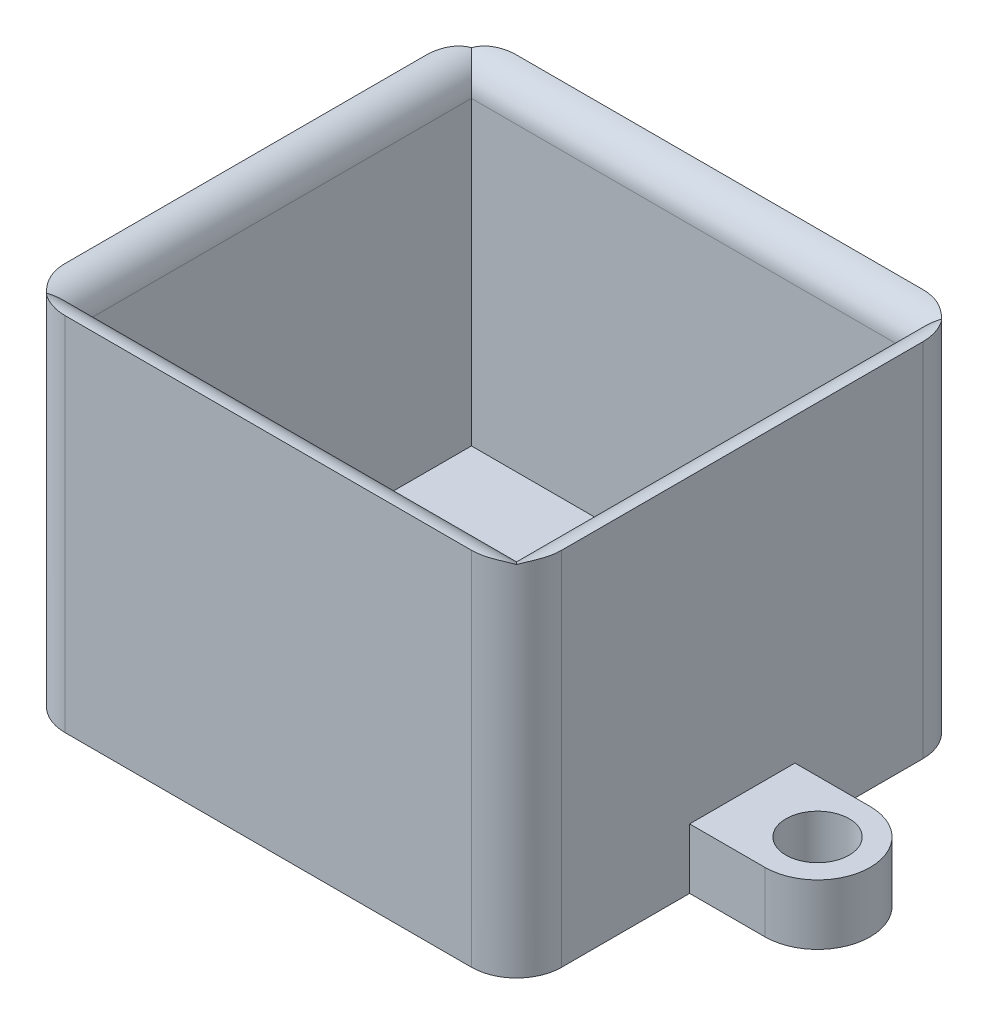
ISO-10303-21;
HEADER;
FILE_DESCRIPTION(('STEP AP214'),'2;1');
FILE_NAME('part.step','',(''),(''),'','','');
FILE_SCHEMA(('AUTOMOTIVE_DESIGN { 1 0 10303 214 1 1 1 1 }'));
ENDSEC;
DATA;
#1=APPLICATION_CONTEXT('core data for automotive mechanical design processes');
#2=APPLICATION_PROTOCOL_DEFINITION('international standard','automotive_design',2000,#1);
#3=PRODUCT_CONTEXT('',#1,'mechanical');
#4=PRODUCT('Part','Part','',(#3));
#5=PRODUCT_RELATED_PRODUCT_CATEGORY('part','',(#4));
#6=PRODUCT_DEFINITION_FORMATION('','',#4);
#7=PRODUCT_DEFINITION_CONTEXT('part definition',#1,'design');
#8=PRODUCT_DEFINITION('design','',#6,#7);
#9=PRODUCT_DEFINITION_SHAPE('','',#8);
#10=(LENGTH_UNIT() NAMED_UNIT(*) SI_UNIT(.MILLI.,.METRE.));
#11=(NAMED_UNIT(*) PLANE_ANGLE_UNIT() SI_UNIT($,.RADIAN.));
#12=(NAMED_UNIT(*) SI_UNIT($,.STERADIAN.) SOLID_ANGLE_UNIT());
#13=UNCERTAINTY_MEASURE_WITH_UNIT(LENGTH_MEASURE(1.E-05),#10,'distance_accuracy_value','');
#14=(GEOMETRIC_REPRESENTATION_CONTEXT(3) GLOBAL_UNCERTAINTY_ASSIGNED_CONTEXT((#13)) GLOBAL_UNIT_ASSIGNED_CONTEXT((#10,
#11,#12)) REPRESENTATION_CONTEXT('',''));
#15=CARTESIAN_POINT('',(0.,0.,0.));
#16=DIRECTION('',(0.,0.,1.));
#17=DIRECTION('',(1.,0.,0.));
#18=AXIS2_PLACEMENT_3D('',#15,#16,#17);
#19=CARTESIAN_POINT('',(16.5,22.,-15.));
#20=DIRECTION('',(-1.,0.,0.));
#21=DIRECTION('',(0.,0.,1.));
#22=AXIS2_PLACEMENT_3D('',#19,#20,#21);
#23=PLANE('',#22);
#24=DIRECTION('',(0.,0.,1.));
#25=VECTOR('',#24,1.);
#26=CARTESIAN_POINT('',(16.5,-2.,15.));
#27=LINE('',#26,#25);
#28=CARTESIAN_POINT('',(16.5,-2.,-12.));
#29=VERTEX_POINT('',#28);
#30=CARTESIAN_POINT('',(16.5,-2.,-3.5));
#31=VERTEX_POINT('',#30);
#32=EDGE_CURVE('E275',#29,#31,#27,.T.);
#33=ORIENTED_EDGE('',*,*,#32,.F.);
#34=DIRECTION('',(0.,-1.,0.));
#35=VECTOR('',#34,1.);
#36=CARTESIAN_POINT('',(16.5,22.,-12.));
#37=LINE('',#36,#35);
#38=CARTESIAN_POINT('',(16.5,22.,-12.));
#39=VERTEX_POINT('',#38);
#40=EDGE_CURVE('E329',#29,#39,#37,.F.);
#41=ORIENTED_EDGE('',*,*,#40,.T.);
#42=DIRECTION('',(0.,0.,-1.));
#43=VECTOR('',#42,1.);
#44=CARTESIAN_POINT('',(16.5,22.,-15.));
#45=LINE('',#44,#43);
#46=CARTESIAN_POINT('',(16.5,22.,12.));
#47=VERTEX_POINT('',#46);
#48=EDGE_CURVE('E300',#47,#39,#45,.T.);
#49=ORIENTED_EDGE('',*,*,#48,.F.);
#50=DIRECTION('',(0.,-1.,0.));
#51=VECTOR('',#50,1.);
#52=CARTESIAN_POINT('',(16.5,22.,12.));
#53=LINE('',#52,#51);
#54=CARTESIAN_POINT('',(16.5,-2.,12.));
#55=VERTEX_POINT('',#54);
#56=EDGE_CURVE('E326',#47,#55,#53,.T.);
#57=ORIENTED_EDGE('',*,*,#56,.T.);
#58=CARTESIAN_POINT('',(16.5,-2.,3.5));
#59=VERTEX_POINT('',#58);
#60=EDGE_CURVE('E274',#59,#55,#27,.T.);
#61=ORIENTED_EDGE('',*,*,#60,.F.);
#62=DIRECTION('',(0.,-1.,0.));
#63=VECTOR('',#62,1.);
#64=CARTESIAN_POINT('',(16.5,2.,3.5));
#65=LINE('',#64,#63);
#66=CARTESIAN_POINT('',(16.5,2.,3.5));
#67=VERTEX_POINT('',#66);
#68=EDGE_CURVE('E199',#67,#59,#65,.T.);
#69=ORIENTED_EDGE('',*,*,#68,.F.);
#70=DIRECTION('',(0.,0.,-1.));
#71=VECTOR('',#70,1.);
#72=CARTESIAN_POINT('',(16.5,2.,3.5));
#73=LINE('',#72,#71);
#74=CARTESIAN_POINT('',(16.5,2.,-3.5));
#75=VERTEX_POINT('',#74);
#76=EDGE_CURVE('E209',#67,#75,#73,.T.);
#77=ORIENTED_EDGE('',*,*,#76,.T.);
#78=DIRECTION('',(0.,-1.,0.));
#79=VECTOR('',#78,1.);
#80=CARTESIAN_POINT('',(16.5,2.,-3.5));
#81=LINE('',#80,#79);
#82=EDGE_CURVE('E229',#75,#31,#81,.T.);
#83=ORIENTED_EDGE('',*,*,#82,.T.);
#84=EDGE_LOOP('',(#33,#41,#49,#57,#61,#69,#77,#83));
#85=FACE_BOUND('',#84,.T.);
#86=ADVANCED_FACE('F35',(#85),#23,.F.);
#87=CARTESIAN_POINT('',(-16.5,22.,-15.));
#88=DIRECTION('',(1.,0.,0.));
#89=DIRECTION('',(0.,0.,-1.));
#90=AXIS2_PLACEMENT_3D('',#87,#88,#89);
#91=PLANE('',#90);
#92=DIRECTION('',(0.,0.,1.));
#93=VECTOR('',#92,1.);
#94=CARTESIAN_POINT('',(-16.5,22.,-15.));
#95=LINE('',#94,#93);
#96=CARTESIAN_POINT('',(-16.5,22.,-12.));
#97=VERTEX_POINT('',#96);
#98=CARTESIAN_POINT('',(-16.5,22.,12.));
#99=VERTEX_POINT('',#98);
#100=EDGE_CURVE('E306',#97,#99,#95,.T.);
#101=ORIENTED_EDGE('',*,*,#100,.F.);
#102=DIRECTION('',(0.,-1.,0.));
#103=VECTOR('',#102,1.);
#104=CARTESIAN_POINT('',(-16.5,22.,-12.));
#105=LINE('',#104,#103);
#106=CARTESIAN_POINT('',(-16.5,-2.,-12.));
#107=VERTEX_POINT('',#106);
#108=EDGE_CURVE('E335',#97,#107,#105,.T.);
#109=ORIENTED_EDGE('',*,*,#108,.T.);
#110=DIRECTION('',(0.,0.,-1.));
#111=VECTOR('',#110,1.);
#112=CARTESIAN_POINT('',(-16.5,-2.,15.));
#113=LINE('',#112,#111);
#114=CARTESIAN_POINT('',(-16.5,-2.,-3.5));
#115=VERTEX_POINT('',#114);
#116=EDGE_CURVE('E262',#115,#107,#113,.T.);
#117=ORIENTED_EDGE('',*,*,#116,.F.);
#118=DIRECTION('',(0.,-1.,0.));
#119=VECTOR('',#118,1.);
#120=CARTESIAN_POINT('',(-16.5,2.,-3.5));
#121=LINE('',#120,#119);
#122=CARTESIAN_POINT('',(-16.5,2.,-3.5));
#123=VERTEX_POINT('',#122);
#124=EDGE_CURVE('E266',#123,#115,#121,.T.);
#125=ORIENTED_EDGE('',*,*,#124,.F.);
#126=DIRECTION('',(0.,0.,1.));
#127=VECTOR('',#126,1.);
#128=CARTESIAN_POINT('',(-16.5,2.,3.5));
#129=LINE('',#128,#127);
#130=CARTESIAN_POINT('',(-16.5,2.,3.5));
#131=VERTEX_POINT('',#130);
#132=EDGE_CURVE('E246',#123,#131,#129,.T.);
#133=ORIENTED_EDGE('',*,*,#132,.T.);
#134=DIRECTION('',(0.,-1.,0.));
#135=VECTOR('',#134,1.);
#136=CARTESIAN_POINT('',(-16.5,2.,3.5));
#137=LINE('',#136,#135);
#138=CARTESIAN_POINT('',(-16.5,-2.,3.5));
#139=VERTEX_POINT('',#138);
#140=EDGE_CURVE('E263',#131,#139,#137,.T.);
#141=ORIENTED_EDGE('',*,*,#140,.T.);
#142=CARTESIAN_POINT('',(-16.5,-2.,12.));
#143=VERTEX_POINT('',#142);
#144=EDGE_CURVE('E269',#143,#139,#113,.T.);
#145=ORIENTED_EDGE('',*,*,#144,.F.);
#146=DIRECTION('',(0.,-1.,0.));
#147=VECTOR('',#146,1.);
#148=CARTESIAN_POINT('',(-16.5,22.,12.));
#149=LINE('',#148,#147);
#150=EDGE_CURVE('E332',#143,#99,#149,.F.);
#151=ORIENTED_EDGE('',*,*,#150,.T.);
#152=EDGE_LOOP('',(#101,#109,#117,#125,#133,#141,#145,#151));
#153=FACE_BOUND('',#152,.T.);
#154=ADVANCED_FACE('F503',(#153),#91,.F.);
#155=CARTESIAN_POINT('',(-16.5,22.,-15.));
#156=DIRECTION('',(0.,0.,1.));
#157=DIRECTION('',(1.,0.,0.));
#158=AXIS2_PLACEMENT_3D('',#155,#156,#157);
#159=PLANE('',#158);
#160=DIRECTION('',(-1.,0.,0.));
#161=VECTOR('',#160,1.);
#162=CARTESIAN_POINT('',(-16.5,22.,-15.));
#163=LINE('',#162,#161);
#164=CARTESIAN_POINT('',(13.5,22.,-15.));
#165=VERTEX_POINT('',#164);
#166=CARTESIAN_POINT('',(-13.5,22.,-15.));
#167=VERTEX_POINT('',#166);
#168=EDGE_CURVE('E303',#165,#167,#163,.T.);
#169=ORIENTED_EDGE('',*,*,#168,.F.);
#170=DIRECTION('',(0.,-1.,0.));
#171=VECTOR('',#170,1.);
#172=CARTESIAN_POINT('',(13.5,22.,-15.));
#173=LINE('',#172,#171);
#174=CARTESIAN_POINT('',(13.5,-2.,-15.));
#175=VERTEX_POINT('',#174);
#176=EDGE_CURVE('E315',#165,#175,#173,.T.);
#177=ORIENTED_EDGE('',*,*,#176,.T.);
#178=DIRECTION('',(1.,0.,0.));
#179=VECTOR('',#178,1.);
#180=CARTESIAN_POINT('',(-16.5,-2.,-15.));
#181=LINE('',#180,#179);
#182=CARTESIAN_POINT('',(-13.5,-2.,-15.));
#183=VERTEX_POINT('',#182);
#184=EDGE_CURVE('E271',#183,#175,#181,.T.);
#185=ORIENTED_EDGE('',*,*,#184,.F.);
#186=DIRECTION('',(0.,-1.,0.));
#187=VECTOR('',#186,1.);
#188=CARTESIAN_POINT('',(-13.5,22.,-15.));
#189=LINE('',#188,#187);
#190=EDGE_CURVE('E312',#183,#167,#189,.F.);
#191=ORIENTED_EDGE('',*,*,#190,.T.);
#192=EDGE_LOOP('',(#169,#177,#185,#191));
#193=FACE_BOUND('',#192,.T.);
#194=ADVANCED_FACE('F433',(#193),#159,.F.);
#195=CARTESIAN_POINT('',(-16.5,22.,15.));
#196=DIRECTION('',(0.,0.,-1.));
#197=DIRECTION('',(-1.,0.,0.));
#198=AXIS2_PLACEMENT_3D('',#195,#196,#197);
#199=PLANE('',#198);
#200=DIRECTION('',(-1.,0.,0.));
#201=VECTOR('',#200,1.);
#202=CARTESIAN_POINT('',(-16.5,-2.,15.));
#203=LINE('',#202,#201);
#204=CARTESIAN_POINT('',(13.5,-2.,15.));
#205=VERTEX_POINT('',#204);
#206=CARTESIAN_POINT('',(-13.5,-2.,15.));
#207=VERTEX_POINT('',#206);
#208=EDGE_CURVE('E277',#205,#207,#203,.T.);
#209=ORIENTED_EDGE('',*,*,#208,.F.);
#210=DIRECTION('',(0.,-1.,0.));
#211=VECTOR('',#210,1.);
#212=CARTESIAN_POINT('',(13.5,22.,15.));
#213=LINE('',#212,#211);
#214=CARTESIAN_POINT('',(13.5,22.,15.));
#215=VERTEX_POINT('',#214);
#216=EDGE_CURVE('E341',#205,#215,#213,.F.);
#217=ORIENTED_EDGE('',*,*,#216,.T.);
#218=DIRECTION('',(1.,0.,0.));
#219=VECTOR('',#218,1.);
#220=CARTESIAN_POINT('',(-16.5,22.,15.));
#221=LINE('',#220,#219);
#222=CARTESIAN_POINT('',(-13.5,22.,15.));
#223=VERTEX_POINT('',#222);
#224=EDGE_CURVE('E309',#223,#215,#221,.T.);
#225=ORIENTED_EDGE('',*,*,#224,.F.);
#226=DIRECTION('',(0.,-1.,0.));
#227=VECTOR('',#226,1.);
#228=CARTESIAN_POINT('',(-13.5,22.,15.));
#229=LINE('',#228,#227);
#230=EDGE_CURVE('E338',#223,#207,#229,.T.);
#231=ORIENTED_EDGE('',*,*,#230,.T.);
#232=EDGE_LOOP('',(#209,#217,#225,#231));
#233=FACE_BOUND('',#232,.T.);
#234=ADVANCED_FACE('F453',(#233),#199,.F.);
#235=CARTESIAN_POINT('',(14.5,22.,-13.));
#236=DIRECTION('',(-1.,0.,0.));
#237=DIRECTION('',(0.,0.,1.));
#238=AXIS2_PLACEMENT_3D('',#235,#236,#237);
#239=PLANE('',#238);
#240=DIRECTION('',(0.,-1.,0.));
#241=VECTOR('',#240,1.);
#242=CARTESIAN_POINT('',(14.5,22.,13.));
#243=LINE('',#242,#241);
#244=CARTESIAN_POINT('',(14.5,20.,13.));
#245=VERTEX_POINT('',#244);
#246=CARTESIAN_POINT('',(14.5,0.,13.));
#247=VERTEX_POINT('',#246);
#248=EDGE_CURVE('E292',#245,#247,#243,.T.);
#249=ORIENTED_EDGE('',*,*,#248,.F.);
#250=DIRECTION('',(0.,0.,-1.));
#251=VECTOR('',#250,1.);
#252=CARTESIAN_POINT('',(14.5,20.,-13.));
#253=LINE('',#252,#251);
#254=CARTESIAN_POINT('',(14.5,20.,-13.));
#255=VERTEX_POINT('',#254);
#256=EDGE_CURVE('E344',#245,#255,#253,.T.);
#257=ORIENTED_EDGE('',*,*,#256,.T.);
#258=DIRECTION('',(0.,-1.,0.));
#259=VECTOR('',#258,1.);
#260=CARTESIAN_POINT('',(14.5,22.,-13.));
#261=LINE('',#260,#259);
#262=CARTESIAN_POINT('',(14.5,0.,-13.));
#263=VERTEX_POINT('',#262);
#264=EDGE_CURVE('E298',#255,#263,#261,.T.);
#265=ORIENTED_EDGE('',*,*,#264,.T.);
#266=DIRECTION('',(0.,0.,-1.));
#267=VECTOR('',#266,1.);
#268=CARTESIAN_POINT('',(14.5,0.,-13.));
#269=LINE('',#268,#267);
#270=EDGE_CURVE('E280',#247,#263,#269,.T.);
#271=ORIENTED_EDGE('',*,*,#270,.F.);
#272=EDGE_LOOP('',(#249,#257,#265,#271));
#273=FACE_BOUND('',#272,.T.);
#274=ADVANCED_FACE('F477',(#273),#239,.T.);
#275=CARTESIAN_POINT('',(-14.5,22.,-13.));
#276=DIRECTION('',(0.,0.,1.));
#277=DIRECTION('',(1.,0.,0.));
#278=AXIS2_PLACEMENT_3D('',#275,#276,#277);
#279=PLANE('',#278);
#280=ORIENTED_EDGE('',*,*,#264,.F.);
#281=DIRECTION('',(-1.,0.,0.));
#282=VECTOR('',#281,1.);
#283=CARTESIAN_POINT('',(-14.5,20.,-13.));
#284=LINE('',#283,#282);
#285=CARTESIAN_POINT('',(-14.5,20.,-13.));
#286=VERTEX_POINT('',#285);
#287=EDGE_CURVE('E415',#255,#286,#284,.T.);
#288=ORIENTED_EDGE('',*,*,#287,.T.);
#289=DIRECTION('',(0.,-1.,0.));
#290=VECTOR('',#289,1.);
#291=CARTESIAN_POINT('',(-14.5,22.,-13.));
#292=LINE('',#291,#290);
#293=CARTESIAN_POINT('',(-14.5,0.,-13.));
#294=VERTEX_POINT('',#293);
#295=EDGE_CURVE('E296',#286,#294,#292,.T.);
#296=ORIENTED_EDGE('',*,*,#295,.T.);
#297=DIRECTION('',(-1.,0.,0.));
#298=VECTOR('',#297,1.);
#299=CARTESIAN_POINT('',(-14.5,0.,-13.));
#300=LINE('',#299,#298);
#301=EDGE_CURVE('E283',#263,#294,#300,.T.);
#302=ORIENTED_EDGE('',*,*,#301,.F.);
#303=EDGE_LOOP('',(#280,#288,#296,#302));
#304=FACE_BOUND('',#303,.T.);
#305=ADVANCED_FACE('F480',(#304),#279,.T.);
#306=CARTESIAN_POINT('',(-14.5,22.,-13.));
#307=DIRECTION('',(1.,0.,0.));
#308=DIRECTION('',(0.,0.,-1.));
#309=AXIS2_PLACEMENT_3D('',#306,#307,#308);
#310=PLANE('',#309);
#311=ORIENTED_EDGE('',*,*,#295,.F.);
#312=DIRECTION('',(0.,0.,1.));
#313=VECTOR('',#312,1.);
#314=CARTESIAN_POINT('',(-14.5,20.,-13.));
#315=LINE('',#314,#313);
#316=CARTESIAN_POINT('',(-14.5,20.,13.));
#317=VERTEX_POINT('',#316);
#318=EDGE_CURVE('E61',#286,#317,#315,.T.);
#319=ORIENTED_EDGE('',*,*,#318,.T.);
#320=DIRECTION('',(0.,-1.,0.));
#321=VECTOR('',#320,1.);
#322=CARTESIAN_POINT('',(-14.5,22.,13.));
#323=LINE('',#322,#321);
#324=CARTESIAN_POINT('',(-14.5,0.,13.));
#325=VERTEX_POINT('',#324);
#326=EDGE_CURVE('E294',#317,#325,#323,.T.);
#327=ORIENTED_EDGE('',*,*,#326,.T.);
#328=DIRECTION('',(0.,0.,1.));
#329=VECTOR('',#328,1.);
#330=CARTESIAN_POINT('',(-14.5,0.,-13.));
#331=LINE('',#330,#329);
#332=EDGE_CURVE('E286',#294,#325,#331,.T.);
#333=ORIENTED_EDGE('',*,*,#332,.F.);
#334=EDGE_LOOP('',(#311,#319,#327,#333));
#335=FACE_BOUND('',#334,.T.);
#336=ADVANCED_FACE('F518',(#335),#310,.T.);
#337=CARTESIAN_POINT('',(-14.5,22.,13.));
#338=DIRECTION('',(0.,0.,-1.));
#339=DIRECTION('',(-1.,0.,0.));
#340=AXIS2_PLACEMENT_3D('',#337,#338,#339);
#341=PLANE('',#340);
#342=ORIENTED_EDGE('',*,*,#326,.F.);
#343=DIRECTION('',(1.,0.,0.));
#344=VECTOR('',#343,1.);
#345=CARTESIAN_POINT('',(-14.5,20.,13.));
#346=LINE('',#345,#344);
#347=EDGE_CURVE('E11',#317,#245,#346,.T.);
#348=ORIENTED_EDGE('',*,*,#347,.T.);
#349=ORIENTED_EDGE('',*,*,#248,.T.);
#350=DIRECTION('',(1.,0.,0.));
#351=VECTOR('',#350,1.);
#352=CARTESIAN_POINT('',(-14.5,0.,13.));
#353=LINE('',#352,#351);
#354=EDGE_CURVE('E289',#325,#247,#353,.T.);
#355=ORIENTED_EDGE('',*,*,#354,.F.);
#356=EDGE_LOOP('',(#342,#348,#349,#355));
#357=FACE_BOUND('',#356,.T.);
#358=ADVANCED_FACE('F486',(#357),#341,.T.);
#359=CARTESIAN_POINT('',(0.,0.,0.));
#360=DIRECTION('',(0.,-1.,0.));
#361=DIRECTION('',(0.,0.,-1.));
#362=AXIS2_PLACEMENT_3D('',#359,#360,#361);
#363=PLANE('',#362);
#364=ORIENTED_EDGE('',*,*,#354,.T.);
#365=ORIENTED_EDGE('',*,*,#270,.T.);
#366=ORIENTED_EDGE('',*,*,#301,.T.);
#367=ORIENTED_EDGE('',*,*,#332,.T.);
#368=EDGE_LOOP('',(#364,#365,#366,#367));
#369=FACE_BOUND('',#368,.T.);
#370=ADVANCED_FACE('F483',(#369),#363,.F.);
#371=CARTESIAN_POINT('',(0.,-2.,0.));
#372=DIRECTION('',(0.,-1.,0.));
#373=DIRECTION('',(0.,0.,-1.));
#374=AXIS2_PLACEMENT_3D('',#371,#372,#373);
#375=PLANE('',#374);
#376=ORIENTED_EDGE('',*,*,#184,.T.);
#377=CARTESIAN_POINT('',(13.5,-2.,-12.));
#378=DIRECTION('',(0.,-1.,0.));
#379=DIRECTION('',(0.,0.,-1.));
#380=AXIS2_PLACEMENT_3D('',#377,#378,#379);
#381=CIRCLE('',#380,3.);
#382=EDGE_CURVE('E324',#175,#29,#381,.T.);
#383=ORIENTED_EDGE('',*,*,#382,.T.);
#384=ORIENTED_EDGE('',*,*,#32,.T.);
#385=DIRECTION('',(1.,0.,0.));
#386=VECTOR('',#385,1.);
#387=CARTESIAN_POINT('',(21.5,-2.,-3.5));
#388=LINE('',#387,#386);
#389=CARTESIAN_POINT('',(21.5,-2.,-3.5));
#390=VERTEX_POINT('',#389);
#391=EDGE_CURVE('E213',#31,#390,#388,.T.);
#392=ORIENTED_EDGE('',*,*,#391,.T.);
#393=CARTESIAN_POINT('',(21.5,-2.,0.));
#394=DIRECTION('',(0.,-1.,0.));
#395=DIRECTION('',(0.,0.,1.));
#396=AXIS2_PLACEMENT_3D('',#393,#394,#395);
#397=CIRCLE('',#396,3.5);
#398=CARTESIAN_POINT('',(21.5,-2.,3.5));
#399=VERTEX_POINT('',#398);
#400=EDGE_CURVE('E223',#390,#399,#397,.T.);
#401=ORIENTED_EDGE('',*,*,#400,.T.);
#402=DIRECTION('',(-1.,0.,0.));
#403=VECTOR('',#402,1.);
#404=CARTESIAN_POINT('',(21.5,-2.,3.5));
#405=LINE('',#404,#403);
#406=EDGE_CURVE('E194',#399,#59,#405,.T.);
#407=ORIENTED_EDGE('',*,*,#406,.T.);
#408=ORIENTED_EDGE('',*,*,#60,.T.);
#409=CARTESIAN_POINT('',(13.5,-2.,12.));
#410=DIRECTION('',(0.,-1.,0.));
#411=DIRECTION('',(0.,0.,-1.));
#412=AXIS2_PLACEMENT_3D('',#409,#410,#411);
#413=CIRCLE('',#412,3.);
#414=EDGE_CURVE('E320',#55,#205,#413,.T.);
#415=ORIENTED_EDGE('',*,*,#414,.T.);
#416=ORIENTED_EDGE('',*,*,#208,.T.);
#417=CARTESIAN_POINT('',(-13.5,-2.,12.));
#418=DIRECTION('',(0.,-1.,0.));
#419=DIRECTION('',(0.,0.,-1.));
#420=AXIS2_PLACEMENT_3D('',#417,#418,#419);
#421=CIRCLE('',#420,3.);
#422=EDGE_CURVE('E318',#207,#143,#421,.T.);
#423=ORIENTED_EDGE('',*,*,#422,.T.);
#424=ORIENTED_EDGE('',*,*,#144,.T.);
#425=DIRECTION('',(-1.,0.,0.));
#426=VECTOR('',#425,1.);
#427=CARTESIAN_POINT('',(-21.5,-2.,3.5));
#428=LINE('',#427,#426);
#429=CARTESIAN_POINT('',(-21.5,-2.,3.5));
#430=VERTEX_POINT('',#429);
#431=EDGE_CURVE('E243',#139,#430,#428,.T.);
#432=ORIENTED_EDGE('',*,*,#431,.T.);
#433=CARTESIAN_POINT('',(-21.5,-2.,0.));
#434=DIRECTION('',(0.,-1.,0.));
#435=DIRECTION('',(0.,0.,-1.));
#436=AXIS2_PLACEMENT_3D('',#433,#434,#435);
#437=CIRCLE('',#436,3.5);
#438=CARTESIAN_POINT('',(-21.5,-2.,-3.5));
#439=VERTEX_POINT('',#438);
#440=EDGE_CURVE('E236',#430,#439,#437,.T.);
#441=ORIENTED_EDGE('',*,*,#440,.T.);
#442=DIRECTION('',(1.,0.,0.));
#443=VECTOR('',#442,1.);
#444=CARTESIAN_POINT('',(-21.5,-2.,-3.5));
#445=LINE('',#444,#443);
#446=EDGE_CURVE('E255',#439,#115,#445,.T.);
#447=ORIENTED_EDGE('',*,*,#446,.T.);
#448=ORIENTED_EDGE('',*,*,#116,.T.);
#449=CARTESIAN_POINT('',(-13.5,-2.,-12.));
#450=DIRECTION('',(0.,-1.,0.));
#451=DIRECTION('',(0.,0.,-1.));
#452=AXIS2_PLACEMENT_3D('',#449,#450,#451);
#453=CIRCLE('',#452,3.);
#454=EDGE_CURVE('E322',#107,#183,#453,.T.);
#455=ORIENTED_EDGE('',*,*,#454,.T.);
#456=EDGE_LOOP('',(#376,#383,#384,#392,#401,#407,#408,#415,#416,#423,#424,#432,#441,#447,#448,#455));
#457=FACE_BOUND('',#456,.T.);
#458=CARTESIAN_POINT('',(-21.5,-2.,0.));
#459=DIRECTION('',(0.,-1.,0.));
#460=DIRECTION('',(0.,0.,-1.));
#461=AXIS2_PLACEMENT_3D('',#458,#459,#460);
#462=CIRCLE('',#461,2.1);
#463=CARTESIAN_POINT('',(-21.5,-2.,-2.1));
#464=VERTEX_POINT('',#463);
#465=EDGE_CURVE('E228',#464,#464,#462,.T.);
#466=ORIENTED_EDGE('',*,*,#465,.F.);
#467=EDGE_LOOP('',(#466));
#468=FACE_BOUND('',#467,.T.);
#469=CARTESIAN_POINT('',(21.5,-2.,0.));
#470=DIRECTION('',(0.,-1.,0.));
#471=DIRECTION('',(0.,0.,1.));
#472=AXIS2_PLACEMENT_3D('',#469,#470,#471);
#473=CIRCLE('',#472,2.1);
#474=CARTESIAN_POINT('',(21.5,-2.,2.1));
#475=VERTEX_POINT('',#474);
#476=EDGE_CURVE('E218',#475,#475,#473,.T.);
#477=ORIENTED_EDGE('',*,*,#476,.F.);
#478=EDGE_LOOP('',(#477));
#479=FACE_BOUND('',#478,.T.);
#480=ADVANCED_FACE('F439',(#457,#468,#479),#375,.T.);
#481=CARTESIAN_POINT('',(-21.5,2.,0.));
#482=DIRECTION('',(0.,-1.,0.));
#483=DIRECTION('',(0.,0.,-1.));
#484=AXIS2_PLACEMENT_3D('',#481,#482,#483);
#485=CYLINDRICAL_SURFACE('',#484,3.5);
#486=ORIENTED_EDGE('',*,*,#440,.F.);
#487=DIRECTION('',(0.,-1.,0.));
#488=VECTOR('',#487,1.);
#489=CARTESIAN_POINT('',(-21.5,2.,3.5));
#490=LINE('',#489,#488);
#491=CARTESIAN_POINT('',(-21.5,2.,3.5));
#492=VERTEX_POINT('',#491);
#493=EDGE_CURVE('E260',#492,#430,#490,.T.);
#494=ORIENTED_EDGE('',*,*,#493,.F.);
#495=CARTESIAN_POINT('',(-21.5,2.,0.));
#496=DIRECTION('',(0.,-1.,0.));
#497=DIRECTION('',(0.,0.,-1.));
#498=AXIS2_PLACEMENT_3D('',#495,#496,#497);
#499=CIRCLE('',#498,3.5);
#500=CARTESIAN_POINT('',(-21.5,2.,-3.5));
#501=VERTEX_POINT('',#500);
#502=EDGE_CURVE('E239',#492,#501,#499,.T.);
#503=ORIENTED_EDGE('',*,*,#502,.T.);
#504=DIRECTION('',(0.,-1.,0.));
#505=VECTOR('',#504,1.);
#506=CARTESIAN_POINT('',(-21.5,2.,-3.5));
#507=LINE('',#506,#505);
#508=EDGE_CURVE('E252',#501,#439,#507,.T.);
#509=ORIENTED_EDGE('',*,*,#508,.T.);
#510=EDGE_LOOP('',(#486,#494,#503,#509));
#511=FACE_BOUND('',#510,.T.);
#512=ADVANCED_FACE('F527',(#511),#485,.T.);
#513=CARTESIAN_POINT('',(-21.5,2.,3.5));
#514=DIRECTION('',(0.,0.,1.));
#515=DIRECTION('',(1.,0.,0.));
#516=AXIS2_PLACEMENT_3D('',#513,#514,#515);
#517=PLANE('',#516);
#518=ORIENTED_EDGE('',*,*,#431,.F.);
#519=ORIENTED_EDGE('',*,*,#140,.F.);
#520=DIRECTION('',(-1.,0.,0.));
#521=VECTOR('',#520,1.);
#522=CARTESIAN_POINT('',(-21.5,2.,3.5));
#523=LINE('',#522,#521);
#524=EDGE_CURVE('E249',#131,#492,#523,.T.);
#525=ORIENTED_EDGE('',*,*,#524,.T.);
#526=ORIENTED_EDGE('',*,*,#493,.T.);
#527=EDGE_LOOP('',(#518,#519,#525,#526));
#528=FACE_BOUND('',#527,.T.);
#529=ADVANCED_FACE('F530',(#528),#517,.T.);
#530=CARTESIAN_POINT('',(-21.5,2.,-3.5));
#531=DIRECTION('',(0.,0.,-1.));
#532=DIRECTION('',(-1.,0.,0.));
#533=AXIS2_PLACEMENT_3D('',#530,#531,#532);
#534=PLANE('',#533);
#535=ORIENTED_EDGE('',*,*,#446,.F.);
#536=ORIENTED_EDGE('',*,*,#508,.F.);
#537=DIRECTION('',(1.,0.,0.));
#538=VECTOR('',#537,1.);
#539=CARTESIAN_POINT('',(-21.5,2.,-3.5));
#540=LINE('',#539,#538);
#541=EDGE_CURVE('E242',#501,#123,#540,.T.);
#542=ORIENTED_EDGE('',*,*,#541,.T.);
#543=ORIENTED_EDGE('',*,*,#124,.T.);
#544=EDGE_LOOP('',(#535,#536,#542,#543));
#545=FACE_BOUND('',#544,.T.);
#546=ADVANCED_FACE('F532',(#545),#534,.T.);
#547=CARTESIAN_POINT('',(-21.5,2.,0.));
#548=DIRECTION('',(0.,-1.,0.));
#549=DIRECTION('',(0.,0.,-1.));
#550=AXIS2_PLACEMENT_3D('',#547,#548,#549);
#551=PLANE('',#550);
#552=CARTESIAN_POINT('',(-21.5,2.,0.));
#553=DIRECTION('',(0.,-1.,0.));
#554=DIRECTION('',(0.,0.,-1.));
#555=AXIS2_PLACEMENT_3D('',#552,#553,#554);
#556=CIRCLE('',#555,2.1);
#557=CARTESIAN_POINT('',(-21.5,2.,-2.1));
#558=VERTEX_POINT('',#557);
#559=EDGE_CURVE('E233',#558,#558,#556,.T.);
#560=ORIENTED_EDGE('',*,*,#559,.T.);
#561=EDGE_LOOP('',(#560));
#562=FACE_BOUND('',#561,.T.);
#563=ORIENTED_EDGE('',*,*,#502,.F.);
#564=ORIENTED_EDGE('',*,*,#524,.F.);
#565=ORIENTED_EDGE('',*,*,#132,.F.);
#566=ORIENTED_EDGE('',*,*,#541,.F.);
#567=EDGE_LOOP('',(#563,#564,#565,#566));
#568=FACE_BOUND('',#567,.T.);
#569=ADVANCED_FACE('F535',(#562,#568),#551,.F.);
#570=CARTESIAN_POINT('',(-21.5,2.,0.));
#571=DIRECTION('',(0.,-1.,0.));
#572=DIRECTION('',(0.,0.,-1.));
#573=AXIS2_PLACEMENT_3D('',#570,#571,#572);
#574=CYLINDRICAL_SURFACE('',#573,2.1);
#575=ORIENTED_EDGE('',*,*,#559,.F.);
#576=EDGE_LOOP('',(#575));
#577=FACE_BOUND('',#576,.T.);
#578=ORIENTED_EDGE('',*,*,#465,.T.);
#579=EDGE_LOOP('',(#578));
#580=FACE_BOUND('',#579,.T.);
#581=ADVANCED_FACE('F542',(#577,#580),#574,.F.);
#582=CARTESIAN_POINT('',(21.5,2.,0.));
#583=DIRECTION('',(0.,-1.,0.));
#584=DIRECTION('',(0.,0.,-1.));
#585=AXIS2_PLACEMENT_3D('',#582,#583,#584);
#586=CYLINDRICAL_SURFACE('',#585,3.5);
#587=ORIENTED_EDGE('',*,*,#400,.F.);
#588=DIRECTION('',(0.,-1.,0.));
#589=VECTOR('',#588,1.);
#590=CARTESIAN_POINT('',(21.5,2.,-3.5));
#591=LINE('',#590,#589);
#592=CARTESIAN_POINT('',(21.5,2.,-3.5));
#593=VERTEX_POINT('',#592);
#594=EDGE_CURVE('E212',#593,#390,#591,.T.);
#595=ORIENTED_EDGE('',*,*,#594,.F.);
#596=CARTESIAN_POINT('',(21.5,2.,0.));
#597=DIRECTION('',(0.,-1.,0.));
#598=DIRECTION('',(0.,0.,1.));
#599=AXIS2_PLACEMENT_3D('',#596,#597,#598);
#600=CIRCLE('',#599,3.5);
#601=CARTESIAN_POINT('',(21.5,2.,3.5));
#602=VERTEX_POINT('',#601);
#603=EDGE_CURVE('E206',#593,#602,#600,.T.);
#604=ORIENTED_EDGE('',*,*,#603,.T.);
#605=DIRECTION('',(0.,-1.,0.));
#606=VECTOR('',#605,1.);
#607=CARTESIAN_POINT('',(21.5,2.,3.5));
#608=LINE('',#607,#606);
#609=EDGE_CURVE('E188',#602,#399,#608,.T.);
#610=ORIENTED_EDGE('',*,*,#609,.T.);
#611=EDGE_LOOP('',(#587,#595,#604,#610));
#612=FACE_BOUND('',#611,.T.);
#613=ADVANCED_FACE('F211',(#612),#586,.T.);
#614=CARTESIAN_POINT('',(21.5,2.,-3.5));
#615=DIRECTION('',(0.,0.,-1.));
#616=DIRECTION('',(-1.,0.,0.));
#617=AXIS2_PLACEMENT_3D('',#614,#615,#616);
#618=PLANE('',#617);
#619=ORIENTED_EDGE('',*,*,#391,.F.);
#620=ORIENTED_EDGE('',*,*,#82,.F.);
#621=DIRECTION('',(1.,0.,0.));
#622=VECTOR('',#621,1.);
#623=CARTESIAN_POINT('',(21.5,2.,-3.5));
#624=LINE('',#623,#622);
#625=EDGE_CURVE('E200',#75,#593,#624,.T.);
#626=ORIENTED_EDGE('',*,*,#625,.T.);
#627=ORIENTED_EDGE('',*,*,#594,.T.);
#628=EDGE_LOOP('',(#619,#620,#626,#627));
#629=FACE_BOUND('',#628,.T.);
#630=ADVANCED_FACE('F445',(#629),#618,.T.);
#631=CARTESIAN_POINT('',(21.5,2.,3.5));
#632=DIRECTION('',(0.,0.,1.));
#633=DIRECTION('',(1.,0.,0.));
#634=AXIS2_PLACEMENT_3D('',#631,#632,#633);
#635=PLANE('',#634);
#636=ORIENTED_EDGE('',*,*,#406,.F.);
#637=ORIENTED_EDGE('',*,*,#609,.F.);
#638=DIRECTION('',(-1.,0.,0.));
#639=VECTOR('',#638,1.);
#640=CARTESIAN_POINT('',(21.5,2.,3.5));
#641=LINE('',#640,#639);
#642=EDGE_CURVE('E191',#602,#67,#641,.T.);
#643=ORIENTED_EDGE('',*,*,#642,.T.);
#644=ORIENTED_EDGE('',*,*,#68,.T.);
#645=EDGE_LOOP('',(#636,#637,#643,#644));
#646=FACE_BOUND('',#645,.T.);
#647=ADVANCED_FACE('F190',(#646),#635,.T.);
#648=CARTESIAN_POINT('',(21.5,2.,0.));
#649=DIRECTION('',(0.,1.,0.));
#650=DIRECTION('',(0.,0.,1.));
#651=AXIS2_PLACEMENT_3D('',#648,#649,#650);
#652=PLANE('',#651);
#653=CARTESIAN_POINT('',(21.5,2.,0.));
#654=DIRECTION('',(0.,-1.,0.));
#655=DIRECTION('',(0.,0.,1.));
#656=AXIS2_PLACEMENT_3D('',#653,#654,#655);
#657=CIRCLE('',#656,2.1);
#658=CARTESIAN_POINT('',(21.5,2.,2.1));
#659=VERTEX_POINT('',#658);
#660=EDGE_CURVE('E225',#659,#659,#657,.T.);
#661=ORIENTED_EDGE('',*,*,#660,.T.);
#662=EDGE_LOOP('',(#661));
#663=FACE_BOUND('',#662,.T.);
#664=ORIENTED_EDGE('',*,*,#603,.F.);
#665=ORIENTED_EDGE('',*,*,#625,.F.);
#666=ORIENTED_EDGE('',*,*,#76,.F.);
#667=ORIENTED_EDGE('',*,*,#642,.F.);
#668=EDGE_LOOP('',(#664,#665,#666,#667));
#669=FACE_BOUND('',#668,.T.);
#670=ADVANCED_FACE('F204',(#663,#669),#652,.T.);
#671=CARTESIAN_POINT('',(21.5,2.,0.));
#672=DIRECTION('',(0.,-1.,0.));
#673=DIRECTION('',(0.,0.,-1.));
#674=AXIS2_PLACEMENT_3D('',#671,#672,#673);
#675=CYLINDRICAL_SURFACE('',#674,2.1);
#676=ORIENTED_EDGE('',*,*,#660,.F.);
#677=EDGE_LOOP('',(#676));
#678=FACE_BOUND('',#677,.T.);
#679=ORIENTED_EDGE('',*,*,#476,.T.);
#680=EDGE_LOOP('',(#679));
#681=FACE_BOUND('',#680,.T.);
#682=ADVANCED_FACE('F494',(#678,#681),#675,.F.);
#683=CARTESIAN_POINT('',(13.5,22.,-12.));
#684=DIRECTION('',(0.,-1.,0.));
#685=DIRECTION('',(0.,0.,-1.));
#686=AXIS2_PLACEMENT_3D('',#683,#684,#685);
#687=CYLINDRICAL_SURFACE('',#686,3.);
#688=CARTESIAN_POINT('',(13.5,22.,-15.));
#689=CARTESIAN_POINT('',(13.5846065271603,21.9999593433504,-15.0000091469539));
#690=CARTESIAN_POINT('',(13.669211686239,21.999998730219,-14.9964212402013));
#691=CARTESIAN_POINT('',(13.8378272708385,21.9999436911634,-14.9821163311987));
#692=CARTESIAN_POINT('',(13.921837625234,21.9998492494992,-14.9713984904469));
#693=CARTESIAN_POINT('',(14.0893460433624,21.9992299567272,-14.9427800787386));
#694=CARTESIAN_POINT('',(14.172834013822,21.9987015276458,-14.9248204321395));
#695=CARTESIAN_POINT('',(14.3379596044148,21.9966240387787,-14.8818569864367));
#696=CARTESIAN_POINT('',(14.4195973802582,21.9950750652132,-14.8568537825063));
#697=CARTESIAN_POINT('',(14.5797412762635,21.9901992646866,-14.8002342875355));
#698=CARTESIAN_POINT('',(14.6582676321572,21.986887166075,-14.7686740834086));
#699=CARTESIAN_POINT('',(14.8122385413398,21.9775472244815,-14.6991041900448));
#700=CARTESIAN_POINT('',(14.8876836141928,21.9715198414286,-14.6610955937495));
#701=CARTESIAN_POINT('',(15.0343416594795,21.9556934836586,-14.5793021581003));
#702=CARTESIAN_POINT('',(15.1055784609714,21.9459186984783,-14.5355555254343));
#703=CARTESIAN_POINT('',(15.2435341552206,21.9213960997871,-14.4427418443036));
#704=CARTESIAN_POINT('',(15.3102572780533,21.9066530221551,-14.3936798926167));
#705=CARTESIAN_POINT('',(15.4180866052535,21.8766125360164,-14.3073975929451));
#706=CARTESIAN_POINT('',(15.4606053826147,21.8629741767701,-14.2713571636922));
#707=CARTESIAN_POINT('',(15.5430215095956,21.832387795602,-14.1975321611019));
#708=CARTESIAN_POINT('',(15.5829129404458,21.8154326211253,-14.1597439556834));
#709=CARTESIAN_POINT('',(15.6213203435596,21.7966418845607,-14.1213203435596));
#710=B_SPLINE_CURVE_WITH_KNOTS('',3,(#688,#689,#690,#691,#692,#693,#694,#695,#696,#697,#698,
#699,#700,#701,#702,#703,#704,#705,#706,#707,#708,#709),.UNSPECIFIED.,.F.,.F.,(4,2,2,2,2,2,2,2,
2,2,4),(0.,0.253741527701469,0.507512901449833,0.763397726949175,1.0192609369314,
1.27301957039842,1.52673523706032,1.77884001424009,2.03070515651123,2.20268303904215,
2.37503595534064),.UNSPECIFIED.);
#711=CARTESIAN_POINT('',(15.6213203435596,21.7966418845607,-14.1213203435596));
#712=VERTEX_POINT('',#711);
#713=EDGE_CURVE('E347',#165,#712,#710,.T.);
#714=ORIENTED_EDGE('',*,*,#713,.T.);
#715=CARTESIAN_POINT('',(15.6213203435596,21.7966418845607,-14.1213203435596));
#716=CARTESIAN_POINT('',(15.6669755820906,21.8189672912212,-14.0757001424394));
#717=CARTESIAN_POINT('',(15.711720856283,21.8386985701109,-14.0279756621899));
#718=CARTESIAN_POINT('',(15.7986794770629,21.873590862716,-13.9288272089484));
#719=CARTESIAN_POINT('',(15.8408964833001,21.8887586167744,-13.8774088324017));
#720=CARTESIAN_POINT('',(15.9219380386643,21.9151106823245,-13.7716194469008));
#721=CARTESIAN_POINT('',(15.9607844897939,21.9263224357358,-13.7172719194659));
#722=CARTESIAN_POINT('',(16.034995114884,21.9455687563171,-13.6057065855318));
#723=CARTESIAN_POINT('',(16.0703580711662,21.9536022154326,-13.5484877858359));
#724=CARTESIAN_POINT('',(16.1703367262689,21.9738162693157,-13.3737575116041));
#725=CARTESIAN_POINT('',(16.2293291359363,21.9822507870325,-13.2525380165038));
#726=CARTESIAN_POINT('',(16.3306465264238,21.9934728760948,-13.0028268854554));
#727=CARTESIAN_POINT('',(16.3729333945176,21.9962475942452,-12.8743193768263));
#728=CARTESIAN_POINT('',(16.4219206241098,21.9985324717739,-12.6828766958127));
#729=CARTESIAN_POINT('',(16.4355548340928,21.9989950183466,-12.6216526100423));
#730=CARTESIAN_POINT('',(16.4589632327745,21.9996139349789,-12.4984620089366));
#731=CARTESIAN_POINT('',(16.4687375930535,21.9997703186496,-12.4364955267291));
#732=CARTESIAN_POINT('',(16.4843632517214,21.9999547290136,-12.3122302949795));
#733=CARTESIAN_POINT('',(16.4902243240528,21.9999830765237,-12.249932767937));
#734=CARTESIAN_POINT('',(16.4980439913021,21.9999997193887,-12.1250906761643));
#735=CARTESIAN_POINT('',(16.5000024228895,21.9999880130674,-12.0625461012047));
#736=CARTESIAN_POINT('',(16.5,22.,-12.));
#737=B_SPLINE_CURVE_WITH_KNOTS('',3,(#715,#716,#717,#718,#719,#720,#721,#722,#723,#724,#725,
#726,#727,#728,#729,#730,#731,#732,#733,#734,#735,#736),.UNSPECIFIED.,.F.,.F.,(4,2,2,2,2,2,2,2,
2,2,4),(0.,0.204721577081598,0.40913927824576,0.612109731866482,0.81515088522656,
1.21882498928749,1.62341480620967,1.81149157380279,1.99955997994791,2.18715688603871,
2.37476164312891),.UNSPECIFIED.);
#738=EDGE_CURVE('E355',#712,#39,#737,.T.);
#739=ORIENTED_EDGE('',*,*,#738,.T.);
#740=ORIENTED_EDGE('',*,*,#40,.F.);
#741=ORIENTED_EDGE('',*,*,#382,.F.);
#742=ORIENTED_EDGE('',*,*,#176,.F.);
#743=EDGE_LOOP('',(#714,#739,#740,#741,#742));
#744=FACE_BOUND('',#743,.T.);
#745=ADVANCED_FACE('F362',(#744),#687,.T.);
#746=CARTESIAN_POINT('',(-13.5,22.,-12.));
#747=DIRECTION('',(0.,-1.,0.));
#748=DIRECTION('',(0.,0.,-1.));
#749=AXIS2_PLACEMENT_3D('',#746,#747,#748);
#750=CYLINDRICAL_SURFACE('',#749,3.);
#751=CARTESIAN_POINT('',(-16.5,22.,-12.));
#752=CARTESIAN_POINT('',(-16.5000091469539,21.9999593433504,-12.0846065271603));
#753=CARTESIAN_POINT('',(-16.4964212402013,21.999998730219,-12.169211686239));
#754=CARTESIAN_POINT('',(-16.4821163311987,21.9999436911634,-12.3378272708385));
#755=CARTESIAN_POINT('',(-16.4713984904469,21.9998492494992,-12.421837625234));
#756=CARTESIAN_POINT('',(-16.4427800787386,21.9992299567272,-12.5893460433624));
#757=CARTESIAN_POINT('',(-16.4248204321395,21.9987015276458,-12.672834013822));
#758=CARTESIAN_POINT('',(-16.3818569864367,21.9966240387787,-12.8379596044148));
#759=CARTESIAN_POINT('',(-16.3568537825063,21.9950750652132,-12.9195973802582));
#760=CARTESIAN_POINT('',(-16.3002342875355,21.9901992646866,-13.0797412762635));
#761=CARTESIAN_POINT('',(-16.2686740834086,21.986887166075,-13.1582676321572));
#762=CARTESIAN_POINT('',(-16.1991041900448,21.9775472244815,-13.3122385413398));
#763=CARTESIAN_POINT('',(-16.1610955937495,21.9715198414286,-13.3876836141928));
#764=CARTESIAN_POINT('',(-16.0793021581003,21.9556934836586,-13.5343416594795));
#765=CARTESIAN_POINT('',(-16.0355555254343,21.9459186984783,-13.6055784609714));
#766=CARTESIAN_POINT('',(-15.9427418443036,21.9213960997871,-13.7435341552207));
#767=CARTESIAN_POINT('',(-15.8936798926167,21.9066530221551,-13.8102572780533));
#768=CARTESIAN_POINT('',(-15.8073975929451,21.8766125360164,-13.9180866052535));
#769=CARTESIAN_POINT('',(-15.7713571636922,21.8629741767701,-13.9606053826147));
#770=CARTESIAN_POINT('',(-15.6975321611019,21.832387795602,-14.0430215095957));
#771=CARTESIAN_POINT('',(-15.6597439556834,21.8154326211253,-14.0829129404458));
#772=CARTESIAN_POINT('',(-15.6213203435596,21.7966418845607,-14.1213203435596));
#773=B_SPLINE_CURVE_WITH_KNOTS('',3,(#751,#752,#753,#754,#755,#756,#757,#758,#759,#760,#761,
#762,#763,#764,#765,#766,#767,#768,#769,#770,#771,#772),.UNSPECIFIED.,.F.,.F.,(4,2,2,2,2,2,2,2,
2,2,4),(0.,0.253741527701469,0.507512901449833,0.763397726949175,1.0192609369314,
1.27301957039842,1.52673523706032,1.77884001424009,2.03070515651123,2.20268303904216,
2.37503595534064),.UNSPECIFIED.);
#774=CARTESIAN_POINT('',(-15.6213203435596,21.7966418845607,-14.1213203435596));
#775=VERTEX_POINT('',#774);
#776=EDGE_CURVE('E384',#97,#775,#773,.T.);
#777=ORIENTED_EDGE('',*,*,#776,.T.);
#778=CARTESIAN_POINT('',(-15.6213203435596,21.7966418845607,-14.1213203435596));
#779=CARTESIAN_POINT('',(-15.5757001424394,21.8189672912212,-14.1669755820906));
#780=CARTESIAN_POINT('',(-15.5279756621899,21.8386985701109,-14.211720856283));
#781=CARTESIAN_POINT('',(-15.4288272089484,21.873590862716,-14.2986794770629));
#782=CARTESIAN_POINT('',(-15.3774088324017,21.8887586167744,-14.3408964833002));
#783=CARTESIAN_POINT('',(-15.2716194469008,21.9151106823245,-14.4219380386643));
#784=CARTESIAN_POINT('',(-15.2172719194659,21.9263224357358,-14.4607844897939));
#785=CARTESIAN_POINT('',(-15.1057065855318,21.9455687563171,-14.534995114884));
#786=CARTESIAN_POINT('',(-15.0484877858359,21.9536022154326,-14.5703580711662));
#787=CARTESIAN_POINT('',(-14.8737575116041,21.9738162693157,-14.6703367262689));
#788=CARTESIAN_POINT('',(-14.7525380165038,21.9822507870325,-14.7293291359363));
#789=CARTESIAN_POINT('',(-14.5028268854554,21.9934728760948,-14.8306465264238));
#790=CARTESIAN_POINT('',(-14.3743193768263,21.9962475942452,-14.8729333945176));
#791=CARTESIAN_POINT('',(-14.1828766958127,21.9985324717739,-14.9219206241098));
#792=CARTESIAN_POINT('',(-14.1216526100423,21.9989950183466,-14.9355548340928));
#793=CARTESIAN_POINT('',(-13.9984620089367,21.9996139349789,-14.9589632327745));
#794=CARTESIAN_POINT('',(-13.9364955267291,21.9997703186496,-14.9687375930535));
#795=CARTESIAN_POINT('',(-13.8122302949795,21.9999547290136,-14.9843632517214));
#796=CARTESIAN_POINT('',(-13.749932767937,21.9999830765237,-14.9902243240529));
#797=CARTESIAN_POINT('',(-13.6250906761643,21.9999997193887,-14.9980439913021));
#798=CARTESIAN_POINT('',(-13.5625461012047,21.9999880130674,-15.0000024228895));
#799=CARTESIAN_POINT('',(-13.5,22.,-15.));
#800=B_SPLINE_CURVE_WITH_KNOTS('',3,(#778,#779,#780,#781,#782,#783,#784,#785,#786,#787,#788,
#789,#790,#791,#792,#793,#794,#795,#796,#797,#798,#799),.UNSPECIFIED.,.F.,.F.,(4,2,2,2,2,2,2,2,
2,2,4),(0.,0.204721577081598,0.409139278245763,0.612109731866484,0.815150885226564,
1.2188249892875,1.62341480620967,1.81149157380279,1.99955997994791,2.18715688603871,
2.37476164312891),.UNSPECIFIED.);
#801=EDGE_CURVE('E377',#775,#167,#800,.T.);
#802=ORIENTED_EDGE('',*,*,#801,.T.);
#803=ORIENTED_EDGE('',*,*,#190,.F.);
#804=ORIENTED_EDGE('',*,*,#454,.F.);
#805=ORIENTED_EDGE('',*,*,#108,.F.);
#806=EDGE_LOOP('',(#777,#802,#803,#804,#805));
#807=FACE_BOUND('',#806,.T.);
#808=ADVANCED_FACE('F391',(#807),#750,.T.);
#809=CARTESIAN_POINT('',(13.5,22.,12.));
#810=DIRECTION('',(0.,-1.,0.));
#811=DIRECTION('',(0.,0.,-1.));
#812=AXIS2_PLACEMENT_3D('',#809,#810,#811);
#813=CYLINDRICAL_SURFACE('',#812,3.);
#814=ORIENTED_EDGE('',*,*,#56,.F.);
#815=CARTESIAN_POINT('',(16.5,22.,12.));
#816=CARTESIAN_POINT('',(16.5000091469539,21.9999593433504,12.0846065271603));
#817=CARTESIAN_POINT('',(16.4964212402013,21.999998730219,12.169211686239));
#818=CARTESIAN_POINT('',(16.4821163311987,21.9999436911634,12.3378272708385));
#819=CARTESIAN_POINT('',(16.4713984904469,21.9998492494992,12.421837625234));
#820=CARTESIAN_POINT('',(16.4427800787386,21.9992299567272,12.5893460433624));
#821=CARTESIAN_POINT('',(16.4248204321395,21.9987015276458,12.672834013822));
#822=CARTESIAN_POINT('',(16.3818569864367,21.9966240387787,12.8379596044148));
#823=CARTESIAN_POINT('',(16.3568537825063,21.9950750652132,12.9195973802582));
#824=CARTESIAN_POINT('',(16.3002342875355,21.9901992646866,13.0797412762635));
#825=CARTESIAN_POINT('',(16.2686740834086,21.986887166075,13.1582676321572));
#826=CARTESIAN_POINT('',(16.1991041900448,21.9775472244815,13.3122385413398));
#827=CARTESIAN_POINT('',(16.1610955937495,21.9715198414286,13.3876836141928));
#828=CARTESIAN_POINT('',(16.0793021581003,21.9556934836586,13.5343416594795));
#829=CARTESIAN_POINT('',(16.0355555254343,21.9459186984783,13.6055784609714));
#830=CARTESIAN_POINT('',(15.9427418443036,21.9213960997871,13.7435341552207));
#831=CARTESIAN_POINT('',(15.8936798926167,21.9066530221551,13.8102572780533));
#832=CARTESIAN_POINT('',(15.8073975929451,21.8766125360164,13.9180866052535));
#833=CARTESIAN_POINT('',(15.7713571636921,21.8629741767701,13.9606053826147));
#834=CARTESIAN_POINT('',(15.6975321611019,21.832387795602,14.0430215095957));
#835=CARTESIAN_POINT('',(15.6597439556834,21.8154326211253,14.0829129404458));
#836=CARTESIAN_POINT('',(15.6213203435596,21.7966418845607,14.1213203435596));
#837=B_SPLINE_CURVE_WITH_KNOTS('',3,(#815,#816,#817,#818,#819,#820,#821,#822,#823,#824,#825,
#826,#827,#828,#829,#830,#831,#832,#833,#834,#835,#836),.UNSPECIFIED.,.F.,.F.,(4,2,2,2,2,2,2,2,
2,2,4),(0.,0.253741527701471,0.507512901449831,0.763397726949174,1.0192609369314,
1.27301957039842,1.52673523706032,1.7788400142401,2.03070515651123,2.20268303904216,
2.37503595534064),.UNSPECIFIED.);
#838=CARTESIAN_POINT('',(15.6213203435596,21.7966418845607,14.1213203435596));
#839=VERTEX_POINT('',#838);
#840=EDGE_CURVE('E410',#47,#839,#837,.T.);
#841=ORIENTED_EDGE('',*,*,#840,.T.);
#842=CARTESIAN_POINT('',(15.6213203435596,21.7966418845607,14.1213203435596));
#843=CARTESIAN_POINT('',(15.5757001424394,21.8189672912212,14.1669755820906));
#844=CARTESIAN_POINT('',(15.5279756621899,21.8386985701109,14.211720856283));
#845=CARTESIAN_POINT('',(15.4288272089484,21.873590862716,14.2986794770629));
#846=CARTESIAN_POINT('',(15.3774088324017,21.8887586167744,14.3408964833001));
#847=CARTESIAN_POINT('',(15.2716194469008,21.9151106823245,14.4219380386643));
#848=CARTESIAN_POINT('',(15.2172719194659,21.9263224357358,14.4607844897939));
#849=CARTESIAN_POINT('',(15.1057065855318,21.9455687563171,14.534995114884));
#850=CARTESIAN_POINT('',(15.0484877858359,21.9536022154326,14.5703580711662));
#851=CARTESIAN_POINT('',(14.8737575116041,21.9738162693157,14.6703367262689));
#852=CARTESIAN_POINT('',(14.7525380165038,21.9822507870325,14.7293291359363));
#853=CARTESIAN_POINT('',(14.5028268854554,21.9934728760948,14.8306465264238));
#854=CARTESIAN_POINT('',(14.3743193768263,21.9962475942452,14.8729333945176));
#855=CARTESIAN_POINT('',(14.1828766958127,21.9985324717739,14.9219206241098));
#856=CARTESIAN_POINT('',(14.1216526100423,21.9989950183466,14.9355548340928));
#857=CARTESIAN_POINT('',(13.9984620089366,21.9996139349789,14.9589632327745));
#858=CARTESIAN_POINT('',(13.9364955267291,21.9997703186496,14.9687375930535));
#859=CARTESIAN_POINT('',(13.8122302949795,21.9999547290136,14.9843632517214));
#860=CARTESIAN_POINT('',(13.749932767937,21.9999830765237,14.9902243240529));
#861=CARTESIAN_POINT('',(13.6250906761643,21.9999997193887,14.9980439913021));
#862=CARTESIAN_POINT('',(13.5625461012046,21.9999880130674,15.0000024228895));
#863=CARTESIAN_POINT('',(13.5,22.,15.));
#864=B_SPLINE_CURVE_WITH_KNOTS('',3,(#842,#843,#844,#845,#846,#847,#848,#849,#850,#851,#852,
#853,#854,#855,#856,#857,#858,#859,#860,#861,#862,#863),.UNSPECIFIED.,.F.,.F.,(4,2,2,2,2,2,2,2,
2,2,4),(0.,0.204721577081596,0.40913927824576,0.612109731866481,0.815150885226559,
1.21882498928749,1.62341480620966,1.81149157380279,1.99955997994791,2.18715688603871,
2.37476164312891),.UNSPECIFIED.);
#865=EDGE_CURVE('E404',#839,#215,#864,.T.);
#866=ORIENTED_EDGE('',*,*,#865,.T.);
#867=ORIENTED_EDGE('',*,*,#216,.F.);
#868=ORIENTED_EDGE('',*,*,#414,.F.);
#869=EDGE_LOOP('',(#814,#841,#866,#867,#868));
#870=FACE_BOUND('',#869,.T.);
#871=ADVANCED_FACE('F395',(#870),#813,.T.);
#872=CARTESIAN_POINT('',(-13.5,22.,12.));
#873=DIRECTION('',(0.,-1.,0.));
#874=DIRECTION('',(0.,0.,-1.));
#875=AXIS2_PLACEMENT_3D('',#872,#873,#874);
#876=CYLINDRICAL_SURFACE('',#875,3.);
#877=CARTESIAN_POINT('',(-13.5,22.,15.));
#878=CARTESIAN_POINT('',(-13.5846065271603,21.9999593433504,15.0000091469539));
#879=CARTESIAN_POINT('',(-13.669211686239,21.999998730219,14.9964212402013));
#880=CARTESIAN_POINT('',(-13.8378272708385,21.9999436911634,14.9821163311987));
#881=CARTESIAN_POINT('',(-13.921837625234,21.9998492494992,14.9713984904469));
#882=CARTESIAN_POINT('',(-14.0893460433624,21.9992299567272,14.9427800787386));
#883=CARTESIAN_POINT('',(-14.172834013822,21.9987015276458,14.9248204321395));
#884=CARTESIAN_POINT('',(-14.3379596044148,21.9966240387787,14.8818569864367));
#885=CARTESIAN_POINT('',(-14.4195973802582,21.9950750652132,14.8568537825063));
#886=CARTESIAN_POINT('',(-14.5797412762635,21.9901992646866,14.8002342875355));
#887=CARTESIAN_POINT('',(-14.6582676321572,21.986887166075,14.7686740834086));
#888=CARTESIAN_POINT('',(-14.8122385413398,21.9775472244815,14.6991041900448));
#889=CARTESIAN_POINT('',(-14.8876836141928,21.9715198414286,14.6610955937495));
#890=CARTESIAN_POINT('',(-15.0343416594795,21.9556934836586,14.5793021581003));
#891=CARTESIAN_POINT('',(-15.1055784609714,21.9459186984783,14.5355555254343));
#892=CARTESIAN_POINT('',(-15.2435341552207,21.9213960997871,14.4427418443036));
#893=CARTESIAN_POINT('',(-15.3102572780534,21.9066530221551,14.3936798926167));
#894=CARTESIAN_POINT('',(-15.4180866052536,21.8766125360164,14.3073975929451));
#895=CARTESIAN_POINT('',(-15.4606053826147,21.8629741767701,14.2713571636922));
#896=CARTESIAN_POINT('',(-15.5430215095957,21.832387795602,14.1975321611019));
#897=CARTESIAN_POINT('',(-15.5829129404458,21.8154326211253,14.1597439556834));
#898=CARTESIAN_POINT('',(-15.6213203435596,21.7966418845607,14.1213203435596));
#899=B_SPLINE_CURVE_WITH_KNOTS('',3,(#877,#878,#879,#880,#881,#882,#883,#884,#885,#886,#887,
#888,#889,#890,#891,#892,#893,#894,#895,#896,#897,#898),.UNSPECIFIED.,.F.,.F.,(4,2,2,2,2,2,2,2,
2,2,4),(0.,0.253741527701471,0.507512901449833,0.763397726949175,1.0192609369314,
1.27301957039842,1.52673523706032,1.77884001424009,2.03070515651123,2.20268303904215,
2.37503595534064),.UNSPECIFIED.);
#900=CARTESIAN_POINT('',(-15.6213203435596,21.7966418845607,14.1213203435596));
#901=VERTEX_POINT('',#900);
#902=EDGE_CURVE('E53',#223,#901,#899,.T.);
#903=ORIENTED_EDGE('',*,*,#902,.T.);
#904=CARTESIAN_POINT('',(-15.6213203435596,21.7966418845607,14.1213203435596));
#905=CARTESIAN_POINT('',(-15.6669755820906,21.8189672912212,14.0757001424394));
#906=CARTESIAN_POINT('',(-15.711720856283,21.8386985701109,14.0279756621899));
#907=CARTESIAN_POINT('',(-15.7986794770629,21.873590862716,13.9288272089484));
#908=CARTESIAN_POINT('',(-15.8408964833002,21.8887586167744,13.8774088324017));
#909=CARTESIAN_POINT('',(-15.9219380386643,21.9151106823245,13.7716194469008));
#910=CARTESIAN_POINT('',(-15.9607844897939,21.9263224357358,13.7172719194659));
#911=CARTESIAN_POINT('',(-16.034995114884,21.9455687563171,13.6057065855318));
#912=CARTESIAN_POINT('',(-16.0703580711662,21.9536022154326,13.5484877858359));
#913=CARTESIAN_POINT('',(-16.1703367262689,21.9738162693157,13.3737575116041));
#914=CARTESIAN_POINT('',(-16.2293291359364,21.9822507870325,13.2525380165038));
#915=CARTESIAN_POINT('',(-16.3306465264238,21.9934728760948,13.0028268854554));
#916=CARTESIAN_POINT('',(-16.3729333945176,21.9962475942452,12.8743193768263));
#917=CARTESIAN_POINT('',(-16.4219206241098,21.9985324717739,12.6828766958127));
#918=CARTESIAN_POINT('',(-16.4355548340928,21.9989950183466,12.6216526100423));
#919=CARTESIAN_POINT('',(-16.4589632327745,21.9996139349789,12.4984620089366));
#920=CARTESIAN_POINT('',(-16.4687375930535,21.9997703186496,12.4364955267291));
#921=CARTESIAN_POINT('',(-16.4843632517215,21.9999547290136,12.3122302949795));
#922=CARTESIAN_POINT('',(-16.4902243240529,21.9999830765237,12.249932767937));
#923=CARTESIAN_POINT('',(-16.4980439913021,21.9999997193887,12.1250906761643));
#924=CARTESIAN_POINT('',(-16.5000024228895,21.9999880130674,12.0625461012047));
#925=CARTESIAN_POINT('',(-16.5,22.,12.));
#926=B_SPLINE_CURVE_WITH_KNOTS('',3,(#904,#905,#906,#907,#908,#909,#910,#911,#912,#913,#914,
#915,#916,#917,#918,#919,#920,#921,#922,#923,#924,#925),.UNSPECIFIED.,.F.,.F.,(4,2,2,2,2,2,2,2,
2,2,4),(0.,0.204721577081597,0.409139278245762,0.612109731866485,0.815150885226561,
1.2188249892875,1.62341480620967,1.81149157380279,1.99955997994791,2.1871568860387,
2.3747616431289),.UNSPECIFIED.);
#927=EDGE_CURVE('E45',#901,#99,#926,.T.);
#928=ORIENTED_EDGE('',*,*,#927,.T.);
#929=ORIENTED_EDGE('',*,*,#150,.F.);
#930=ORIENTED_EDGE('',*,*,#422,.F.);
#931=ORIENTED_EDGE('',*,*,#230,.F.);
#932=EDGE_LOOP('',(#903,#928,#929,#930,#931));
#933=FACE_BOUND('',#932,.T.);
#934=ADVANCED_FACE('F400',(#933),#876,.T.);
#935=CARTESIAN_POINT('',(-16.5,20.,-13.));
#936=DIRECTION('',(0.,0.,1.));
#937=DIRECTION('',(1.,0.,0.));
#938=AXIS2_PLACEMENT_3D('',#935,#936,#937);
#939=CYLINDRICAL_SURFACE('',#938,2.);
#940=ORIENTED_EDGE('',*,*,#100,.T.);
#941=ORIENTED_EDGE('',*,*,#927,.F.);
#942=CARTESIAN_POINT('',(-16.5,20.,15.));
#943=DIRECTION('',(0.707106781186547,0.,0.707106781186547));
#944=DIRECTION('',(0.707106781186547,0.,-0.707106781186547));
#945=AXIS2_PLACEMENT_3D('',#942,#943,#944);
#946=ELLIPSE('',#945,2.82842712474619,2.);
#947=EDGE_CURVE('E40',#317,#901,#946,.T.);
#948=ORIENTED_EDGE('',*,*,#947,.F.);
#949=ORIENTED_EDGE('',*,*,#318,.F.);
#950=CARTESIAN_POINT('',(-16.5,20.,-15.));
#951=DIRECTION('',(-0.707106781186547,0.,0.707106781186547));
#952=DIRECTION('',(0.707106781186547,0.,0.707106781186547));
#953=AXIS2_PLACEMENT_3D('',#950,#951,#952);
#954=ELLIPSE('',#953,2.82842712474619,2.);
#955=EDGE_CURVE('E426',#775,#286,#954,.F.);
#956=ORIENTED_EDGE('',*,*,#955,.F.);
#957=ORIENTED_EDGE('',*,*,#776,.F.);
#958=EDGE_LOOP('',(#940,#941,#948,#949,#956,#957));
#959=FACE_BOUND('',#958,.T.);
#960=ADVANCED_FACE('F37',(#959),#939,.T.);
#961=CARTESIAN_POINT('',(-14.5,20.,15.));
#962=DIRECTION('',(1.,0.,0.));
#963=DIRECTION('',(0.,0.,-1.));
#964=AXIS2_PLACEMENT_3D('',#961,#962,#963);
#965=CYLINDRICAL_SURFACE('',#964,2.);
#966=ORIENTED_EDGE('',*,*,#224,.T.);
#967=ORIENTED_EDGE('',*,*,#865,.F.);
#968=CARTESIAN_POINT('',(16.5,20.,15.));
#969=DIRECTION('',(0.707106781186547,0.,-0.707106781186547));
#970=DIRECTION('',(0.707106781186547,0.,0.707106781186547));
#971=AXIS2_PLACEMENT_3D('',#968,#969,#970);
#972=ELLIPSE('',#971,2.82842712474619,2.);
#973=EDGE_CURVE('E428',#245,#839,#972,.T.);
#974=ORIENTED_EDGE('',*,*,#973,.F.);
#975=ORIENTED_EDGE('',*,*,#347,.F.);
#976=ORIENTED_EDGE('',*,*,#947,.T.);
#977=ORIENTED_EDGE('',*,*,#902,.F.);
#978=EDGE_LOOP('',(#966,#967,#974,#975,#976,#977));
#979=FACE_BOUND('',#978,.T.);
#980=ADVANCED_FACE('F370',(#979),#965,.T.);
#981=CARTESIAN_POINT('',(-14.5,20.,-15.));
#982=DIRECTION('',(-1.,0.,0.));
#983=DIRECTION('',(0.,0.,1.));
#984=AXIS2_PLACEMENT_3D('',#981,#982,#983);
#985=CYLINDRICAL_SURFACE('',#984,2.);
#986=ORIENTED_EDGE('',*,*,#955,.T.);
#987=ORIENTED_EDGE('',*,*,#287,.F.);
#988=CARTESIAN_POINT('',(16.5,20.,-15.));
#989=DIRECTION('',(-0.707106781186547,0.,-0.707106781186547));
#990=DIRECTION('',(-0.707106781186547,0.,0.707106781186547));
#991=AXIS2_PLACEMENT_3D('',#988,#989,#990);
#992=ELLIPSE('',#991,2.82842712474619,2.);
#993=EDGE_CURVE('E468',#712,#255,#992,.F.);
#994=ORIENTED_EDGE('',*,*,#993,.F.);
#995=ORIENTED_EDGE('',*,*,#713,.F.);
#996=ORIENTED_EDGE('',*,*,#168,.T.);
#997=ORIENTED_EDGE('',*,*,#801,.F.);
#998=EDGE_LOOP('',(#986,#987,#994,#995,#996,#997));
#999=FACE_BOUND('',#998,.T.);
#1000=ADVANCED_FACE('F366',(#999),#985,.T.);
#1001=CARTESIAN_POINT('',(16.5,20.,-13.));
#1002=DIRECTION('',(0.,0.,-1.));
#1003=DIRECTION('',(-1.,0.,0.));
#1004=AXIS2_PLACEMENT_3D('',#1001,#1002,#1003);
#1005=CYLINDRICAL_SURFACE('',#1004,2.);
#1006=ORIENTED_EDGE('',*,*,#840,.F.);
#1007=ORIENTED_EDGE('',*,*,#48,.T.);
#1008=ORIENTED_EDGE('',*,*,#738,.F.);
#1009=ORIENTED_EDGE('',*,*,#993,.T.);
#1010=ORIENTED_EDGE('',*,*,#256,.F.);
#1011=ORIENTED_EDGE('',*,*,#973,.T.);
#1012=EDGE_LOOP('',(#1006,#1007,#1008,#1009,#1010,#1011));
#1013=FACE_BOUND('',#1012,.T.);
#1014=ADVANCED_FACE('F369',(#1013),#1005,.T.);
#1015=CLOSED_SHELL('',(#86,#154,#194,#234,#274,#305,#336,#358,#370,#480,#512,#529,#546,#569,
#581,#613,#630,#647,#670,#682,#745,#808,#871,#934,#960,#980,#1000,#1014));
#1016=MANIFOLD_SOLID_BREP('B2',#1015);
#1017=ADVANCED_BREP_SHAPE_REPRESENTATION('',(#18,#1016),#14);
#1018=SHAPE_DEFINITION_REPRESENTATION(#9,#1017);
ENDSEC;
END-ISO-10303-21;
